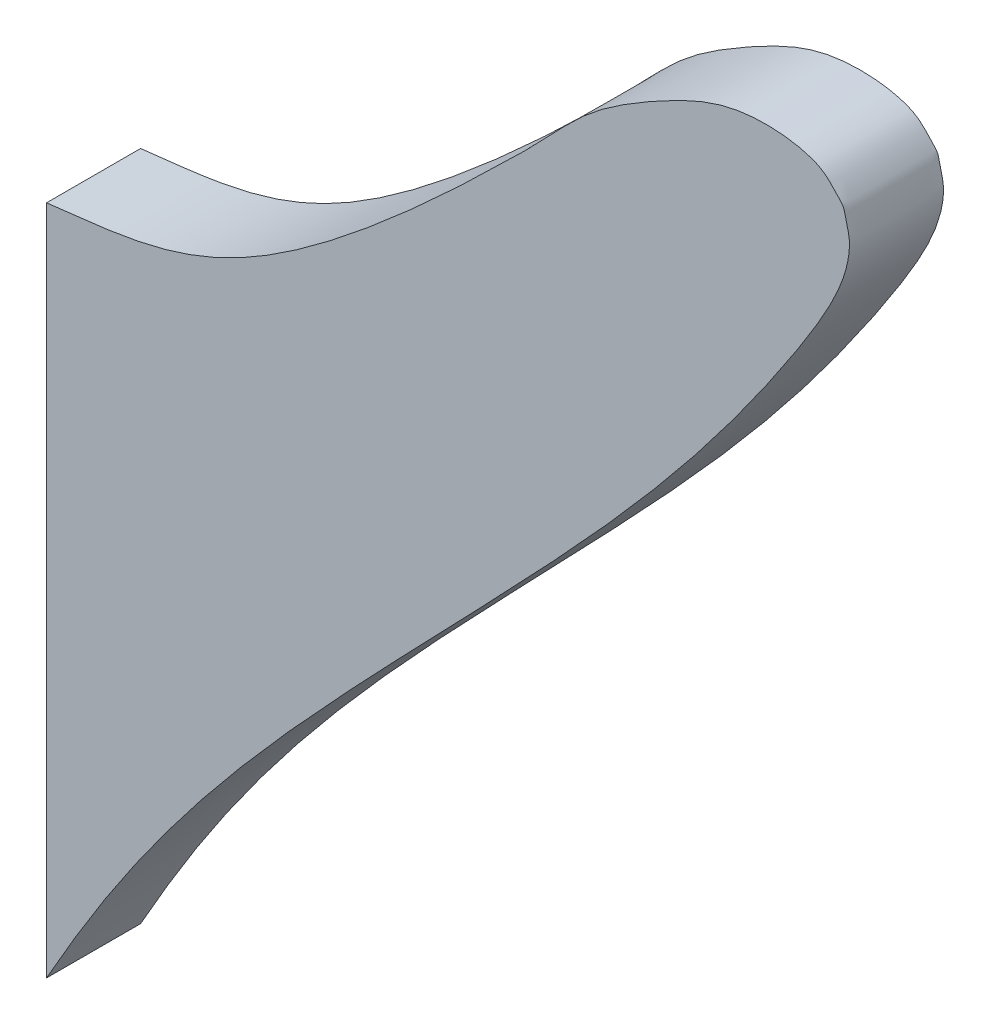
ISO-10303-21;
HEADER;
FILE_DESCRIPTION(('STEP AP214'),'2;1');
FILE_NAME('part.step','',(''),(''),'','','');
FILE_SCHEMA(('AUTOMOTIVE_DESIGN { 1 0 10303 214 1 1 1 1 }'));
ENDSEC;
DATA;
#1=APPLICATION_CONTEXT('core data for automotive mechanical design processes');
#2=APPLICATION_PROTOCOL_DEFINITION('international standard','automotive_design',2000,#1);
#3=PRODUCT_CONTEXT('',#1,'mechanical');
#4=PRODUCT('Part','Part','',(#3));
#5=PRODUCT_RELATED_PRODUCT_CATEGORY('part','',(#4));
#6=PRODUCT_DEFINITION_FORMATION('','',#4);
#7=PRODUCT_DEFINITION_CONTEXT('part definition',#1,'design');
#8=PRODUCT_DEFINITION('design','',#6,#7);
#9=PRODUCT_DEFINITION_SHAPE('','',#8);
#10=(LENGTH_UNIT() NAMED_UNIT(*) SI_UNIT(.MILLI.,.METRE.));
#11=(NAMED_UNIT(*) PLANE_ANGLE_UNIT() SI_UNIT($,.RADIAN.));
#12=(NAMED_UNIT(*) SI_UNIT($,.STERADIAN.) SOLID_ANGLE_UNIT());
#13=UNCERTAINTY_MEASURE_WITH_UNIT(LENGTH_MEASURE(1.E-05),#10,'distance_accuracy_value','');
#14=(GEOMETRIC_REPRESENTATION_CONTEXT(3) GLOBAL_UNCERTAINTY_ASSIGNED_CONTEXT((#13)) GLOBAL_UNIT_ASSIGNED_CONTEXT((#10,
#11,#12)) REPRESENTATION_CONTEXT('',''));
#15=CARTESIAN_POINT('',(0.,0.,0.));
#16=DIRECTION('',(0.,0.,1.));
#17=DIRECTION('',(1.,0.,0.));
#18=AXIS2_PLACEMENT_3D('',#15,#16,#17);
#19=CARTESIAN_POINT('',(32.099228330564,-93.1096221950851,83.9999999999997));
#20=CARTESIAN_POINT('',(32.5957820599692,-92.2330279151648,83.9999999999997));
#21=CARTESIAN_POINT('',(33.0951218752206,-91.3581978324059,83.9999999999997));
#22=CARTESIAN_POINT('',(34.1094025627134,-89.618416522737,83.9999999999997));
#23=CARTESIAN_POINT('',(34.6237793896912,-88.7531081327288,83.9999999999997));
#24=CARTESIAN_POINT('',(36.1931590651253,-86.1738044011613,83.9999999999997));
#25=CARTESIAN_POINT('',(37.274765064249,-84.4766546291517,83.9999999999997));
#26=CARTESIAN_POINT('',(39.5140338333732,-81.1305155319738,83.9999999999997));
#27=CARTESIAN_POINT('',(40.6722117242091,-79.4801608710243,83.9999999999997));
#28=CARTESIAN_POINT('',(43.0588989946347,-76.2316652140037,83.9999999999997));
#29=CARTESIAN_POINT('',(44.2853730079333,-74.6359957784043,83.9999999999997));
#30=CARTESIAN_POINT('',(48.0520736412831,-69.924274325562,83.9999999999997));
#31=CARTESIAN_POINT('',(50.6809620401847,-66.884702303374,83.9999999999997));
#32=CARTESIAN_POINT('',(56.0741438761168,-60.9223591711925,83.9999999999997));
#33=CARTESIAN_POINT('',(58.8344391330934,-57.9961047415613,83.9999999999997));
#34=CARTESIAN_POINT('',(64.3922696897535,-52.1758591561064,83.9999999999997));
#35=CARTESIAN_POINT('',(67.1902353910697,-49.2830992729907,83.9999999999997));
#36=CARTESIAN_POINT('',(72.7548859676472,-43.4690695804566,83.9999999999997));
#37=CARTESIAN_POINT('',(75.5214078421098,-40.5476512090801,83.9999999999997));
#38=CARTESIAN_POINT('',(79.5840894417048,-36.0861379883033,83.9999999999997));
#39=CARTESIAN_POINT('',(80.9235098056345,-34.5854716892154,83.9999999999997));
#40=CARTESIAN_POINT('',(83.5575634755656,-31.5433193339586,83.9999999999997));
#41=CARTESIAN_POINT('',(84.8524436716613,-30.0020582980105,83.9999999999997));
#42=CARTESIAN_POINT('',(87.3893325432273,-26.8713481394599,83.9999999999997));
#43=CARTESIAN_POINT('',(88.6317942863675,-25.2811290935483,83.9999999999997));
#44=CARTESIAN_POINT('',(91.049036471828,-22.0585161615974,83.9999999999997));
#45=CARTESIAN_POINT('',(92.2245345063367,-20.424691788881,83.9999999999997));
#46=CARTESIAN_POINT('',(94.5110208799733,-17.1131876936567,83.9999999999997));
#47=CARTESIAN_POINT('',(95.6273327327901,-15.439127032649,83.9999999999997));
#48=CARTESIAN_POINT('',(97.22943017208,-12.8788368230408,83.9999999999997));
#49=CARTESIAN_POINT('',(97.7497031607458,-12.0160526972969,83.9999999999997));
#50=CARTESIAN_POINT('',(98.7316070971936,-10.250618078432,83.9999999999997));
#51=CARTESIAN_POINT('',(99.1947968714466,-9.3468571377443,83.9999999999997));
#52=CARTESIAN_POINT('',(99.7602470161609,-7.94816674221357,83.9999999999997));
#53=CARTESIAN_POINT('',(99.9272322129646,-7.47391466398775,83.9999999999997));
#54=CARTESIAN_POINT('',(100.127320726445,-6.74373402352404,83.9999999999997));
#55=CARTESIAN_POINT('',(100.186284829965,-6.49745529208348,83.9999999999997));
#56=CARTESIAN_POINT('',(100.284526173099,-5.99755176866837,83.9999999999997));
#57=CARTESIAN_POINT('',(100.323432535258,-5.74485387858416,83.9999999999997));
#58=CARTESIAN_POINT('',(100.371203848613,-5.24083928050495,83.9999999999997));
#59=CARTESIAN_POINT('',(100.380289001774,-4.98849529040822,83.9999999999997));
#60=CARTESIAN_POINT('',(100.353666865192,-4.48278834387093,83.9999999999997));
#61=CARTESIAN_POINT('',(100.312750871623,-4.22770188919473,83.9999999999997));
#62=CARTESIAN_POINT('',(100.196295431205,-3.72668407850795,83.9999999999997));
#63=CARTESIAN_POINT('',(100.123405279225,-3.48000352448232,83.9999999999997));
#64=CARTESIAN_POINT('',(100.036667565735,-3.10408249723559,83.9999999999997));
#65=CARTESIAN_POINT('',(100.010429086327,-2.97807728455001,83.9999999999997));
#66=CARTESIAN_POINT('',(99.9543395516739,-2.72701010036028,83.9999999999997));
#67=CARTESIAN_POINT('',(99.923379377811,-2.602237719001,83.9999999999997));
#68=CARTESIAN_POINT('',(99.8090570241877,-2.36637508564809,83.9999999999997));
#69=CARTESIAN_POINT('',(99.7280428611345,-2.26068485694845,83.9999999999997));
#70=CARTESIAN_POINT('',(99.5565556897895,-2.06445239699321,83.9999999999997));
#71=CARTESIAN_POINT('',(99.4662161977567,-1.97026294518681,83.9999999999997));
#72=CARTESIAN_POINT('',(99.1958577870924,-1.68713062472285,83.9999999999997));
#73=CARTESIAN_POINT('',(99.0206282299158,-1.49331052659899,83.9999999999997));
#74=CARTESIAN_POINT('',(98.6538266214996,-1.12389483968848,83.9999999999997));
#75=CARTESIAN_POINT('',(98.4645808042253,-0.945888102777317,83.9999999999997));
#76=CARTESIAN_POINT('',(98.0458074493733,-0.636056236501907,83.9999999999997));
#77=CARTESIAN_POINT('',(97.8137170554325,-0.503115338925525,83.9999999999997));
#78=CARTESIAN_POINT('',(97.3365908709124,-0.284093792323029,83.9999999999997));
#79=CARTESIAN_POINT('',(97.0907112965205,-0.1952371296246,83.9999999999997));
#80=CARTESIAN_POINT('',(96.590239651119,-0.0421188029619063,83.9999999999997));
#81=CARTESIAN_POINT('',(96.3356387120472,0.0235563048458895,83.9999999999997));
#82=CARTESIAN_POINT('',(95.5647275756303,0.191011050820752,83.9999999999997));
#83=CARTESIAN_POINT('',(95.0464357421343,0.258967253696331,83.9999999999997));
#84=CARTESIAN_POINT('',(94.004838113524,0.344544678944924,83.9999999999997));
#85=CARTESIAN_POINT('',(93.4794052138563,0.360032990475676,83.9999999999997));
#86=CARTESIAN_POINT('',(92.4322113954403,0.337025366471198,83.9999999999997));
#87=CARTESIAN_POINT('',(91.9131962505047,0.29938296300682,83.9999999999997));
#88=CARTESIAN_POINT('',(90.8849239495179,0.168429625406537,83.9999999999997));
#89=CARTESIAN_POINT('',(90.3757412472808,0.0746939383324678,83.9999999999997));
#90=CARTESIAN_POINT('',(89.3680106019826,-0.173447869488458,83.9999999999997));
#91=CARTESIAN_POINT('',(88.8690537641019,-0.327226504412531,83.9999999999997));
#92=CARTESIAN_POINT('',(87.3865189943557,-0.859965719310441,83.9999999999997));
#93=CARTESIAN_POINT('',(86.444431793792,-1.29792225098329,83.9999999999997));
#94=CARTESIAN_POINT('',(85.0595029604763,-2.00532332360087,83.9999999999997));
#95=CARTESIAN_POINT('',(84.6025547288433,-2.24952467896947,83.9999999999997));
#96=CARTESIAN_POINT('',(83.694396512668,-2.74819574974252,83.9999999999997));
#97=CARTESIAN_POINT('',(83.2436814938118,-3.00355118613291,83.9999999999997));
#98=CARTESIAN_POINT('',(81.9025843266247,-3.78938724449986,83.9999999999997));
#99=CARTESIAN_POINT('',(81.0216111693178,-4.3367048736463,83.9999999999997));
#100=CARTESIAN_POINT('',(79.7376732511766,-5.22482508592158,83.9999999999997));
#101=CARTESIAN_POINT('',(79.3153287328466,-5.53322050005114,83.9999999999997));
#102=CARTESIAN_POINT('',(78.4917466961094,-6.17681509861942,83.9999999999997));
#103=CARTESIAN_POINT('',(78.0916836470616,-6.51118159606514,83.9999999999997));
#104=CARTESIAN_POINT('',(76.9286246109498,-7.5540744840487,83.9999999999997));
#105=CARTESIAN_POINT('',(76.2054019281063,-8.30522705552301,83.9999999999997));
#106=CARTESIAN_POINT('',(75.1268713464142,-9.4387114913547,83.9999999999997));
#107=CARTESIAN_POINT('',(74.768986199605,-9.81822273191319,83.9999999999997));
#108=CARTESIAN_POINT('',(74.0477578892523,-10.571698887942,83.9999999999997));
#109=CARTESIAN_POINT('',(73.6837563151489,-10.945017834883,83.9999999999997));
#110=CARTESIAN_POINT('',(72.5828545948093,-12.0559943862647,83.9999999999997));
#111=CARTESIAN_POINT('',(71.8373481779989,-12.7849651504354,83.9999999999997));
#112=CARTESIAN_POINT('',(70.3427028598642,-14.2392401878755,83.9999999999997));
#113=CARTESIAN_POINT('',(69.5941201583207,-14.9651058679252,83.9999999999997));
#114=CARTESIAN_POINT('',(67.3394558346251,-17.133703217655,83.9999999999997));
#115=CARTESIAN_POINT('',(65.8190333486185,-18.5609862447751,83.9999999999997));
#116=CARTESIAN_POINT('',(62.7315684414061,-21.3569497642824,83.9999999999997));
#117=CARTESIAN_POINT('',(61.1669554041556,-22.7295887407225,83.9999999999997));
#118=CARTESIAN_POINT('',(57.9737711081443,-25.3972405421279,83.9999999999997));
#119=CARTESIAN_POINT('',(56.3456008730415,-26.6927400898708,83.9999999999997));
#120=CARTESIAN_POINT('',(53.8240074390548,-28.5396967101901,83.9999999999997));
#121=CARTESIAN_POINT('',(52.9700388163531,-29.1390398376752,83.9999999999997));
#122=CARTESIAN_POINT('',(51.6612258415561,-30.0042407721745,83.9999999999997));
#123=CARTESIAN_POINT('',(51.2196946790628,-30.2872900845461,83.9999999999997));
#124=CARTESIAN_POINT('',(50.3336233937961,-30.8349338564283,83.9999999999997));
#125=CARTESIAN_POINT('',(49.8882620547073,-31.1000895623866,83.9999999999997));
#126=CARTESIAN_POINT('',(48.5441646147436,-31.865696479371,83.9999999999997));
#127=CARTESIAN_POINT('',(47.6372015603696,-32.3354918154368,83.9999999999997));
#128=CARTESIAN_POINT('',(45.797645643368,-33.1795788242573,83.9999999999997));
#129=CARTESIAN_POINT('',(44.8650686293624,-33.5539295533046,83.9999999999997));
#130=CARTESIAN_POINT('',(42.9732102257502,-34.203123216759,83.9999999999997));
#131=CARTESIAN_POINT('',(42.0138852186042,-34.4778036203062,83.9999999999997));
#132=CARTESIAN_POINT('',(40.071461275108,-34.9385762761407,83.9999999999997));
#133=CARTESIAN_POINT('',(39.0883526283966,-35.1246323449712,83.9999999999997));
#134=CARTESIAN_POINT('',(36.115097601689,-35.593634241483,83.9999999999997));
#135=CARTESIAN_POINT('',(34.1018193735866,-35.7903844873846,83.9999999999997));
#136=CARTESIAN_POINT('',(32.0992283305639,-36.0269581028376,83.9999999999997));
#137=B_SPLINE_CURVE_WITH_KNOTS('',3,(#19,#20,#21,#22,#23,#24,#25,#26,#27,#28,#29,#30,#31,#32,
#33,#34,#35,#36,#37,#38,#39,#40,#41,#42,#43,#44,#45,#46,#47,#48,#49,#50,#51,#52,#53,#54,#55,#56,
#57,#58,#59,#60,#61,#62,#63,#64,#65,#66,#67,#68,#69,#70,#71,#72,#73,#74,#75,#76,#77,#78,#79,#80,
#81,#82,#83,#84,#85,#86,#87,#88,#89,#90,#91,#92,#93,#94,#95,#96,#97,#98,#99,#100,#101,#102,#103,
#104,#105,#106,#107,#108,#109,#110,#111,#112,#113,#114,#115,#116,#117,#118,#119,#120,#121,#122,
#123,#124,#125,#126,#127,#128,#129,#130,#131,#132,#133,#134,#135,#136),.UNSPECIFIED.,.F.,.F.,(4,
2,2,2,2,2,2,2,2,2,2,2,2,2,2,2,2,2,2,2,2,2,2,2,2,2,2,2,2,2,2,2,2,2,2,2,2,2,2,2,2,2,2,2,2,2,2,2,2,
2,2,2,2,2,2,2,2,2,4),(0.,0.0156250000000003,0.0312500000000008,0.0625000000000012,
0.0937500000000018,0.125000000000002,0.187500000000003,0.250000000000005,0.312500000000006,
0.375000000000007,0.406250000000007,0.437500000000008,0.468750000000008,0.500000000000009,
0.531250000000009,0.54687500000001,0.56250000000001,0.57031250000001,0.57421875000001,
0.57812500000001,0.58203125000001,0.58593750000001,0.58984375000001,0.59179687500001,
0.59375000000001,0.59570312500001,0.59765625000001,0.601562500000011,0.605468750000011,
0.609375000000011,0.613281250000011,0.617187500000011,0.625000000000011,0.632812500000011,
0.640625000000011,0.648437500000011,0.656250000000011,0.671875000000011,0.679687500000011,
0.687500000000011,0.70312500000001,0.71093750000001,0.71875000000001,0.734375000000009,
0.742187500000009,0.750000000000009,0.765625000000008,0.781250000000008,0.812500000000007,
0.843750000000006,0.875000000000005,0.890625000000004,0.898437500000004,0.906250000000004,
0.921875000000003,0.937500000000003,0.953125000000002,0.968750000000001,1.),.UNSPECIFIED.);
#138=DIRECTION('',(0.,0.,-1.));
#139=VECTOR('',#138,1.);
#140=SURFACE_OF_LINEAR_EXTRUSION('',#137,#139);
#141=CARTESIAN_POINT('',(32.099228330564,-93.1096221950851,75.9999999999997));
#142=CARTESIAN_POINT('',(32.5957820599692,-92.2330279151648,75.9999999999997));
#143=CARTESIAN_POINT('',(33.0951218752206,-91.3581978324059,75.9999999999997));
#144=CARTESIAN_POINT('',(34.1094025627134,-89.618416522737,75.9999999999997));
#145=CARTESIAN_POINT('',(34.6237793896912,-88.7531081327288,75.9999999999997));
#146=CARTESIAN_POINT('',(36.1931590651253,-86.1738044011613,75.9999999999997));
#147=CARTESIAN_POINT('',(37.274765064249,-84.4766546291517,75.9999999999997));
#148=CARTESIAN_POINT('',(39.5140338333732,-81.1305155319738,75.9999999999997));
#149=CARTESIAN_POINT('',(40.6722117242091,-79.4801608710243,75.9999999999997));
#150=CARTESIAN_POINT('',(43.0588989946347,-76.2316652140037,75.9999999999997));
#151=CARTESIAN_POINT('',(44.2853730079333,-74.6359957784043,75.9999999999997));
#152=CARTESIAN_POINT('',(48.0520736412831,-69.924274325562,75.9999999999997));
#153=CARTESIAN_POINT('',(50.6809620401847,-66.884702303374,75.9999999999997));
#154=CARTESIAN_POINT('',(56.0741438761168,-60.9223591711925,75.9999999999997));
#155=CARTESIAN_POINT('',(58.8344391330934,-57.9961047415613,75.9999999999997));
#156=CARTESIAN_POINT('',(64.3922696897535,-52.1758591561064,75.9999999999997));
#157=CARTESIAN_POINT('',(67.1902353910697,-49.2830992729907,75.9999999999997));
#158=CARTESIAN_POINT('',(72.7548859676472,-43.4690695804566,75.9999999999997));
#159=CARTESIAN_POINT('',(75.5214078421098,-40.5476512090801,75.9999999999997));
#160=CARTESIAN_POINT('',(79.5840894417048,-36.0861379883033,75.9999999999997));
#161=CARTESIAN_POINT('',(80.9235098056345,-34.5854716892154,75.9999999999997));
#162=CARTESIAN_POINT('',(83.5575634755656,-31.5433193339586,75.9999999999997));
#163=CARTESIAN_POINT('',(84.8524436716613,-30.0020582980105,75.9999999999997));
#164=CARTESIAN_POINT('',(87.3893325432273,-26.8713481394599,75.9999999999997));
#165=CARTESIAN_POINT('',(88.6317942863675,-25.2811290935483,75.9999999999997));
#166=CARTESIAN_POINT('',(91.049036471828,-22.0585161615974,75.9999999999997));
#167=CARTESIAN_POINT('',(92.2245345063367,-20.424691788881,75.9999999999997));
#168=CARTESIAN_POINT('',(94.5110208799733,-17.1131876936567,75.9999999999997));
#169=CARTESIAN_POINT('',(95.6273327327901,-15.439127032649,75.9999999999997));
#170=CARTESIAN_POINT('',(97.22943017208,-12.8788368230408,75.9999999999997));
#171=CARTESIAN_POINT('',(97.7497031607458,-12.0160526972969,75.9999999999997));
#172=CARTESIAN_POINT('',(98.7316070971936,-10.250618078432,75.9999999999997));
#173=CARTESIAN_POINT('',(99.1947968714466,-9.3468571377443,75.9999999999997));
#174=CARTESIAN_POINT('',(99.7602470161609,-7.94816674221357,75.9999999999997));
#175=CARTESIAN_POINT('',(99.9272322129646,-7.47391466398775,75.9999999999997));
#176=CARTESIAN_POINT('',(100.127320726445,-6.74373402352404,75.9999999999997));
#177=CARTESIAN_POINT('',(100.186284829965,-6.49745529208348,75.9999999999997));
#178=CARTESIAN_POINT('',(100.284526173099,-5.99755176866837,75.9999999999997));
#179=CARTESIAN_POINT('',(100.323432535258,-5.74485387858416,75.9999999999997));
#180=CARTESIAN_POINT('',(100.371203848613,-5.24083928050495,75.9999999999997));
#181=CARTESIAN_POINT('',(100.380289001774,-4.98849529040822,75.9999999999997));
#182=CARTESIAN_POINT('',(100.353666865192,-4.48278834387093,75.9999999999997));
#183=CARTESIAN_POINT('',(100.312750871623,-4.22770188919473,75.9999999999997));
#184=CARTESIAN_POINT('',(100.196295431205,-3.72668407850795,75.9999999999997));
#185=CARTESIAN_POINT('',(100.123405279225,-3.48000352448232,75.9999999999997));
#186=CARTESIAN_POINT('',(100.036667565735,-3.10408249723559,75.9999999999997));
#187=CARTESIAN_POINT('',(100.010429086327,-2.97807728455001,75.9999999999997));
#188=CARTESIAN_POINT('',(99.9543395516739,-2.72701010036028,75.9999999999997));
#189=CARTESIAN_POINT('',(99.923379377811,-2.602237719001,75.9999999999997));
#190=CARTESIAN_POINT('',(99.8090570241877,-2.36637508564809,75.9999999999997));
#191=CARTESIAN_POINT('',(99.7280428611345,-2.26068485694845,75.9999999999997));
#192=CARTESIAN_POINT('',(99.5565556897895,-2.06445239699321,75.9999999999997));
#193=CARTESIAN_POINT('',(99.4662161977567,-1.97026294518681,75.9999999999997));
#194=CARTESIAN_POINT('',(99.1958577870924,-1.68713062472285,75.9999999999997));
#195=CARTESIAN_POINT('',(99.0206282299158,-1.49331052659899,75.9999999999997));
#196=CARTESIAN_POINT('',(98.6538266214996,-1.12389483968848,75.9999999999997));
#197=CARTESIAN_POINT('',(98.4645808042253,-0.945888102777317,75.9999999999997));
#198=CARTESIAN_POINT('',(98.0458074493733,-0.636056236501907,75.9999999999997));
#199=CARTESIAN_POINT('',(97.8137170554325,-0.503115338925525,75.9999999999997));
#200=CARTESIAN_POINT('',(97.3365908709124,-0.284093792323029,75.9999999999997));
#201=CARTESIAN_POINT('',(97.0907112965205,-0.1952371296246,75.9999999999997));
#202=CARTESIAN_POINT('',(96.590239651119,-0.0421188029619063,75.9999999999997));
#203=CARTESIAN_POINT('',(96.3356387120472,0.0235563048458895,75.9999999999997));
#204=CARTESIAN_POINT('',(95.5647275756303,0.191011050820752,75.9999999999997));
#205=CARTESIAN_POINT('',(95.0464357421343,0.258967253696331,75.9999999999997));
#206=CARTESIAN_POINT('',(94.004838113524,0.344544678944924,75.9999999999997));
#207=CARTESIAN_POINT('',(93.4794052138563,0.360032990475676,75.9999999999997));
#208=CARTESIAN_POINT('',(92.4322113954403,0.337025366471198,75.9999999999997));
#209=CARTESIAN_POINT('',(91.9131962505047,0.29938296300682,75.9999999999997));
#210=CARTESIAN_POINT('',(90.8849239495179,0.168429625406537,75.9999999999997));
#211=CARTESIAN_POINT('',(90.3757412472808,0.0746939383324678,75.9999999999997));
#212=CARTESIAN_POINT('',(89.3680106019826,-0.173447869488458,75.9999999999997));
#213=CARTESIAN_POINT('',(88.8690537641019,-0.327226504412531,75.9999999999997));
#214=CARTESIAN_POINT('',(87.3865189943557,-0.859965719310441,75.9999999999997));
#215=CARTESIAN_POINT('',(86.444431793792,-1.29792225098329,75.9999999999997));
#216=CARTESIAN_POINT('',(85.0595029604763,-2.00532332360087,75.9999999999997));
#217=CARTESIAN_POINT('',(84.6025547288433,-2.24952467896947,75.9999999999997));
#218=CARTESIAN_POINT('',(83.694396512668,-2.74819574974252,75.9999999999997));
#219=CARTESIAN_POINT('',(83.2436814938118,-3.00355118613291,75.9999999999997));
#220=CARTESIAN_POINT('',(81.9025843266247,-3.78938724449986,75.9999999999997));
#221=CARTESIAN_POINT('',(81.0216111693178,-4.3367048736463,75.9999999999997));
#222=CARTESIAN_POINT('',(79.7376732511766,-5.22482508592158,75.9999999999997));
#223=CARTESIAN_POINT('',(79.3153287328466,-5.53322050005114,75.9999999999997));
#224=CARTESIAN_POINT('',(78.4917466961094,-6.17681509861942,75.9999999999997));
#225=CARTESIAN_POINT('',(78.0916836470616,-6.51118159606514,75.9999999999997));
#226=CARTESIAN_POINT('',(76.9286246109498,-7.5540744840487,75.9999999999997));
#227=CARTESIAN_POINT('',(76.2054019281063,-8.30522705552301,75.9999999999997));
#228=CARTESIAN_POINT('',(75.1268713464142,-9.4387114913547,75.9999999999997));
#229=CARTESIAN_POINT('',(74.768986199605,-9.81822273191319,75.9999999999997));
#230=CARTESIAN_POINT('',(74.0477578892523,-10.571698887942,75.9999999999997));
#231=CARTESIAN_POINT('',(73.6837563151489,-10.945017834883,75.9999999999997));
#232=CARTESIAN_POINT('',(72.5828545948093,-12.0559943862647,75.9999999999997));
#233=CARTESIAN_POINT('',(71.8373481779989,-12.7849651504354,75.9999999999997));
#234=CARTESIAN_POINT('',(70.3427028598642,-14.2392401878755,75.9999999999997));
#235=CARTESIAN_POINT('',(69.5941201583207,-14.9651058679252,75.9999999999997));
#236=CARTESIAN_POINT('',(67.3394558346251,-17.133703217655,75.9999999999997));
#237=CARTESIAN_POINT('',(65.8190333486185,-18.5609862447751,75.9999999999997));
#238=CARTESIAN_POINT('',(62.7315684414061,-21.3569497642824,75.9999999999997));
#239=CARTESIAN_POINT('',(61.1669554041556,-22.7295887407225,75.9999999999997));
#240=CARTESIAN_POINT('',(57.9737711081443,-25.3972405421279,75.9999999999997));
#241=CARTESIAN_POINT('',(56.3456008730415,-26.6927400898708,75.9999999999997));
#242=CARTESIAN_POINT('',(53.8240074390548,-28.5396967101901,75.9999999999997));
#243=CARTESIAN_POINT('',(52.9700388163531,-29.1390398376752,75.9999999999997));
#244=CARTESIAN_POINT('',(51.6612258415561,-30.0042407721745,75.9999999999997));
#245=CARTESIAN_POINT('',(51.2196946790628,-30.2872900845461,75.9999999999997));
#246=CARTESIAN_POINT('',(50.3336233937961,-30.8349338564283,75.9999999999997));
#247=CARTESIAN_POINT('',(49.8882620547073,-31.1000895623866,75.9999999999997));
#248=CARTESIAN_POINT('',(48.5441646147436,-31.865696479371,75.9999999999997));
#249=CARTESIAN_POINT('',(47.6372015603696,-32.3354918154368,75.9999999999997));
#250=CARTESIAN_POINT('',(45.797645643368,-33.1795788242573,75.9999999999997));
#251=CARTESIAN_POINT('',(44.8650686293624,-33.5539295533046,75.9999999999997));
#252=CARTESIAN_POINT('',(42.9732102257502,-34.203123216759,75.9999999999997));
#253=CARTESIAN_POINT('',(42.0138852186042,-34.4778036203062,75.9999999999997));
#254=CARTESIAN_POINT('',(40.071461275108,-34.9385762761407,75.9999999999997));
#255=CARTESIAN_POINT('',(39.0883526283966,-35.1246323449712,75.9999999999997));
#256=CARTESIAN_POINT('',(36.115097601689,-35.593634241483,75.9999999999997));
#257=CARTESIAN_POINT('',(34.1018193735866,-35.7903844873846,75.9999999999997));
#258=CARTESIAN_POINT('',(32.0992283305639,-36.0269581028376,75.9999999999997));
#259=B_SPLINE_CURVE_WITH_KNOTS('',3,(#141,#142,#143,#144,#145,#146,#147,#148,#149,#150,#151,
#152,#153,#154,#155,#156,#157,#158,#159,#160,#161,#162,#163,#164,#165,#166,#167,#168,#169,#170,
#171,#172,#173,#174,#175,#176,#177,#178,#179,#180,#181,#182,#183,#184,#185,#186,#187,#188,#189,
#190,#191,#192,#193,#194,#195,#196,#197,#198,#199,#200,#201,#202,#203,#204,#205,#206,#207,#208,
#209,#210,#211,#212,#213,#214,#215,#216,#217,#218,#219,#220,#221,#222,#223,#224,#225,#226,#227,
#228,#229,#230,#231,#232,#233,#234,#235,#236,#237,#238,#239,#240,#241,#242,#243,#244,#245,#246,
#247,#248,#249,#250,#251,#252,#253,#254,#255,#256,#257,#258),.UNSPECIFIED.,.F.,.F.,(4,2,2,2,2,2,
2,2,2,2,2,2,2,2,2,2,2,2,2,2,2,2,2,2,2,2,2,2,2,2,2,2,2,2,2,2,2,2,2,2,2,2,2,2,2,2,2,2,2,2,2,2,2,2,
2,2,2,2,4),(0.,0.0156250000000003,0.0312500000000008,0.0625000000000012,0.0937500000000018,
0.125000000000002,0.187500000000003,0.250000000000005,0.312500000000006,0.375000000000007,
0.406250000000007,0.437500000000008,0.468750000000008,0.500000000000009,0.531250000000009,
0.54687500000001,0.56250000000001,0.57031250000001,0.57421875000001,0.57812500000001,
0.58203125000001,0.58593750000001,0.58984375000001,0.59179687500001,0.59375000000001,
0.59570312500001,0.59765625000001,0.601562500000011,0.605468750000011,0.609375000000011,
0.613281250000011,0.617187500000011,0.625000000000011,0.632812500000011,0.640625000000011,
0.648437500000011,0.656250000000011,0.671875000000011,0.679687500000011,0.687500000000011,
0.70312500000001,0.71093750000001,0.71875000000001,0.734375000000009,0.742187500000009,
0.750000000000009,0.765625000000008,0.781250000000008,0.812500000000007,0.843750000000006,
0.875000000000005,0.890625000000004,0.898437500000004,0.906250000000004,0.921875000000003,
0.937500000000003,0.953125000000002,0.968750000000001,1.),.UNSPECIFIED.);
#260=CARTESIAN_POINT('',(32.0992283305639,-93.1096221950853,75.9999999999997));
#261=VERTEX_POINT('',#260);
#262=CARTESIAN_POINT('',(32.099228330564,-36.0269581028375,75.9999999999997));
#263=VERTEX_POINT('',#262);
#264=EDGE_CURVE('E65',#261,#263,#259,.T.);
#265=ORIENTED_EDGE('',*,*,#264,.T.);
#266=DIRECTION('',(0.,0.,-1.));
#267=VECTOR('',#266,1.);
#268=CARTESIAN_POINT('',(32.099228330564,-36.0269581028375,83.9999999999997));
#269=LINE('',#268,#267);
#270=CARTESIAN_POINT('',(32.099228330564,-36.0269581028375,83.9999999999997));
#271=VERTEX_POINT('',#270);
#272=EDGE_CURVE('E11',#271,#263,#269,.T.);
#273=ORIENTED_EDGE('',*,*,#272,.F.);
#274=CARTESIAN_POINT('',(32.0992283305639,-36.0269581028376,83.9999999999997));
#275=CARTESIAN_POINT('',(34.1018193735866,-35.7903844873846,83.9999999999997));
#276=CARTESIAN_POINT('',(36.115097601689,-35.593634241483,83.9999999999997));
#277=CARTESIAN_POINT('',(39.0883526283966,-35.1246323449712,83.9999999999997));
#278=CARTESIAN_POINT('',(40.071461275108,-34.9385762761407,83.9999999999997));
#279=CARTESIAN_POINT('',(42.0138852186042,-34.4778036203062,83.9999999999997));
#280=CARTESIAN_POINT('',(42.9732102257502,-34.203123216759,83.9999999999997));
#281=CARTESIAN_POINT('',(44.8650686293624,-33.5539295533046,83.9999999999997));
#282=CARTESIAN_POINT('',(45.797645643368,-33.1795788242573,83.9999999999997));
#283=CARTESIAN_POINT('',(47.6372015603696,-32.3354918154368,83.9999999999997));
#284=CARTESIAN_POINT('',(48.5441646147436,-31.865696479371,83.9999999999997));
#285=CARTESIAN_POINT('',(49.8882620547073,-31.1000895623866,83.9999999999997));
#286=CARTESIAN_POINT('',(50.3336233937961,-30.8349338564283,83.9999999999997));
#287=CARTESIAN_POINT('',(51.2196946790628,-30.2872900845461,83.9999999999997));
#288=CARTESIAN_POINT('',(51.6612258415561,-30.0042407721745,83.9999999999997));
#289=CARTESIAN_POINT('',(52.9700388163531,-29.1390398376752,83.9999999999997));
#290=CARTESIAN_POINT('',(53.8240074390548,-28.5396967101901,83.9999999999997));
#291=CARTESIAN_POINT('',(56.3456008730415,-26.6927400898708,83.9999999999997));
#292=CARTESIAN_POINT('',(57.9737711081443,-25.3972405421279,83.9999999999997));
#293=CARTESIAN_POINT('',(61.1669554041556,-22.7295887407225,83.9999999999997));
#294=CARTESIAN_POINT('',(62.7315684414061,-21.3569497642824,83.9999999999997));
#295=CARTESIAN_POINT('',(65.8190333486185,-18.5609862447751,83.9999999999997));
#296=CARTESIAN_POINT('',(67.3394558346251,-17.133703217655,83.9999999999997));
#297=CARTESIAN_POINT('',(69.5941201583207,-14.9651058679252,83.9999999999997));
#298=CARTESIAN_POINT('',(70.3427028598642,-14.2392401878755,83.9999999999997));
#299=CARTESIAN_POINT('',(71.8373481779989,-12.7849651504354,83.9999999999997));
#300=CARTESIAN_POINT('',(72.5828545948093,-12.0559943862647,83.9999999999997));
#301=CARTESIAN_POINT('',(73.6837563151489,-10.945017834883,83.9999999999997));
#302=CARTESIAN_POINT('',(74.0477578892523,-10.571698887942,83.9999999999997));
#303=CARTESIAN_POINT('',(74.768986199605,-9.81822273191319,83.9999999999997));
#304=CARTESIAN_POINT('',(75.1268713464142,-9.4387114913547,83.9999999999997));
#305=CARTESIAN_POINT('',(76.2054019281063,-8.30522705552301,83.9999999999997));
#306=CARTESIAN_POINT('',(76.9286246109498,-7.5540744840487,83.9999999999997));
#307=CARTESIAN_POINT('',(78.0916836470616,-6.51118159606514,83.9999999999997));
#308=CARTESIAN_POINT('',(78.4917466961094,-6.17681509861942,83.9999999999997));
#309=CARTESIAN_POINT('',(79.3153287328466,-5.53322050005114,83.9999999999997));
#310=CARTESIAN_POINT('',(79.7376732511766,-5.22482508592158,83.9999999999997));
#311=CARTESIAN_POINT('',(81.0216111693178,-4.3367048736463,83.9999999999997));
#312=CARTESIAN_POINT('',(81.9025843266247,-3.78938724449986,83.9999999999997));
#313=CARTESIAN_POINT('',(83.2436814938118,-3.00355118613291,83.9999999999997));
#314=CARTESIAN_POINT('',(83.694396512668,-2.74819574974252,83.9999999999997));
#315=CARTESIAN_POINT('',(84.6025547288433,-2.24952467896947,83.9999999999997));
#316=CARTESIAN_POINT('',(85.0595029604763,-2.00532332360087,83.9999999999997));
#317=CARTESIAN_POINT('',(86.444431793792,-1.29792225098329,83.9999999999997));
#318=CARTESIAN_POINT('',(87.3865189943557,-0.859965719310441,83.9999999999997));
#319=CARTESIAN_POINT('',(88.8690537641019,-0.327226504412531,83.9999999999997));
#320=CARTESIAN_POINT('',(89.3680106019826,-0.173447869488458,83.9999999999997));
#321=CARTESIAN_POINT('',(90.3757412472808,0.0746939383324678,83.9999999999997));
#322=CARTESIAN_POINT('',(90.8849239495179,0.168429625406537,83.9999999999997));
#323=CARTESIAN_POINT('',(91.9131962505047,0.29938296300682,83.9999999999997));
#324=CARTESIAN_POINT('',(92.4322113954403,0.337025366471198,83.9999999999997));
#325=CARTESIAN_POINT('',(93.4794052138563,0.360032990475676,83.9999999999997));
#326=CARTESIAN_POINT('',(94.004838113524,0.344544678944924,83.9999999999997));
#327=CARTESIAN_POINT('',(95.0464357421343,0.258967253696331,83.9999999999997));
#328=CARTESIAN_POINT('',(95.5647275756303,0.191011050820752,83.9999999999997));
#329=CARTESIAN_POINT('',(96.3356387120472,0.0235563048458895,83.9999999999997));
#330=CARTESIAN_POINT('',(96.590239651119,-0.0421188029619063,83.9999999999997));
#331=CARTESIAN_POINT('',(97.0907112965205,-0.1952371296246,83.9999999999997));
#332=CARTESIAN_POINT('',(97.3365908709124,-0.284093792323029,83.9999999999997));
#333=CARTESIAN_POINT('',(97.8137170554325,-0.503115338925525,83.9999999999997));
#334=CARTESIAN_POINT('',(98.0458074493733,-0.636056236501907,83.9999999999997));
#335=CARTESIAN_POINT('',(98.4645808042253,-0.945888102777317,83.9999999999997));
#336=CARTESIAN_POINT('',(98.6538266214996,-1.12389483968848,83.9999999999997));
#337=CARTESIAN_POINT('',(99.0206282299158,-1.49331052659899,83.9999999999997));
#338=CARTESIAN_POINT('',(99.1958577870924,-1.68713062472285,83.9999999999997));
#339=CARTESIAN_POINT('',(99.4662161977567,-1.97026294518681,83.9999999999997));
#340=CARTESIAN_POINT('',(99.5565556897895,-2.06445239699321,83.9999999999997));
#341=CARTESIAN_POINT('',(99.7280428611345,-2.26068485694845,83.9999999999997));
#342=CARTESIAN_POINT('',(99.8090570241877,-2.36637508564809,83.9999999999997));
#343=CARTESIAN_POINT('',(99.923379377811,-2.602237719001,83.9999999999997));
#344=CARTESIAN_POINT('',(99.9543395516739,-2.72701010036028,83.9999999999997));
#345=CARTESIAN_POINT('',(100.010429086327,-2.97807728455001,83.9999999999997));
#346=CARTESIAN_POINT('',(100.036667565735,-3.10408249723559,83.9999999999997));
#347=CARTESIAN_POINT('',(100.123405279225,-3.48000352448232,83.9999999999997));
#348=CARTESIAN_POINT('',(100.196295431205,-3.72668407850795,83.9999999999997));
#349=CARTESIAN_POINT('',(100.312750871623,-4.22770188919473,83.9999999999997));
#350=CARTESIAN_POINT('',(100.353666865192,-4.48278834387093,83.9999999999997));
#351=CARTESIAN_POINT('',(100.380289001774,-4.98849529040822,83.9999999999997));
#352=CARTESIAN_POINT('',(100.371203848613,-5.24083928050495,83.9999999999997));
#353=CARTESIAN_POINT('',(100.323432535258,-5.74485387858416,83.9999999999997));
#354=CARTESIAN_POINT('',(100.284526173099,-5.99755176866837,83.9999999999997));
#355=CARTESIAN_POINT('',(100.186284829965,-6.49745529208348,83.9999999999997));
#356=CARTESIAN_POINT('',(100.127320726445,-6.74373402352404,83.9999999999997));
#357=CARTESIAN_POINT('',(99.9272322129646,-7.47391466398775,83.9999999999997));
#358=CARTESIAN_POINT('',(99.7602470161609,-7.94816674221357,83.9999999999997));
#359=CARTESIAN_POINT('',(99.1947968714466,-9.3468571377443,83.9999999999997));
#360=CARTESIAN_POINT('',(98.7316070971936,-10.250618078432,83.9999999999997));
#361=CARTESIAN_POINT('',(97.7497031607458,-12.0160526972969,83.9999999999997));
#362=CARTESIAN_POINT('',(97.22943017208,-12.8788368230408,83.9999999999997));
#363=CARTESIAN_POINT('',(95.6273327327901,-15.439127032649,83.9999999999997));
#364=CARTESIAN_POINT('',(94.5110208799733,-17.1131876936567,83.9999999999997));
#365=CARTESIAN_POINT('',(92.2245345063367,-20.424691788881,83.9999999999997));
#366=CARTESIAN_POINT('',(91.049036471828,-22.0585161615974,83.9999999999997));
#367=CARTESIAN_POINT('',(88.6317942863675,-25.2811290935483,83.9999999999997));
#368=CARTESIAN_POINT('',(87.3893325432273,-26.8713481394599,83.9999999999997));
#369=CARTESIAN_POINT('',(84.8524436716613,-30.0020582980105,83.9999999999997));
#370=CARTESIAN_POINT('',(83.5575634755656,-31.5433193339586,83.9999999999997));
#371=CARTESIAN_POINT('',(80.9235098056345,-34.5854716892154,83.9999999999997));
#372=CARTESIAN_POINT('',(79.5840894417048,-36.0861379883033,83.9999999999997));
#373=CARTESIAN_POINT('',(75.5214078421098,-40.5476512090801,83.9999999999997));
#374=CARTESIAN_POINT('',(72.7548859676472,-43.4690695804566,83.9999999999997));
#375=CARTESIAN_POINT('',(67.1902353910697,-49.2830992729907,83.9999999999997));
#376=CARTESIAN_POINT('',(64.3922696897535,-52.1758591561064,83.9999999999997));
#377=CARTESIAN_POINT('',(58.8344391330934,-57.9961047415613,83.9999999999997));
#378=CARTESIAN_POINT('',(56.0741438761168,-60.9223591711925,83.9999999999997));
#379=CARTESIAN_POINT('',(50.6809620401847,-66.884702303374,83.9999999999997));
#380=CARTESIAN_POINT('',(48.0520736412831,-69.924274325562,83.9999999999997));
#381=CARTESIAN_POINT('',(44.2853730079333,-74.6359957784043,83.9999999999997));
#382=CARTESIAN_POINT('',(43.0588989946347,-76.2316652140037,83.9999999999997));
#383=CARTESIAN_POINT('',(40.6722117242091,-79.4801608710243,83.9999999999997));
#384=CARTESIAN_POINT('',(39.5140338333732,-81.1305155319738,83.9999999999997));
#385=CARTESIAN_POINT('',(37.274765064249,-84.4766546291517,83.9999999999997));
#386=CARTESIAN_POINT('',(36.1931590651253,-86.1738044011613,83.9999999999997));
#387=CARTESIAN_POINT('',(34.6237793896912,-88.7531081327288,83.9999999999997));
#388=CARTESIAN_POINT('',(34.1094025627134,-89.618416522737,83.9999999999997));
#389=CARTESIAN_POINT('',(33.0951218752206,-91.3581978324059,83.9999999999997));
#390=CARTESIAN_POINT('',(32.5957820599692,-92.2330279151648,83.9999999999997));
#391=CARTESIAN_POINT('',(32.099228330564,-93.1096221950851,83.9999999999997));
#392=B_SPLINE_CURVE_WITH_KNOTS('',3,(#274,#275,#276,#277,#278,#279,#280,#281,#282,#283,#284,
#285,#286,#287,#288,#289,#290,#291,#292,#293,#294,#295,#296,#297,#298,#299,#300,#301,#302,#303,
#304,#305,#306,#307,#308,#309,#310,#311,#312,#313,#314,#315,#316,#317,#318,#319,#320,#321,#322,
#323,#324,#325,#326,#327,#328,#329,#330,#331,#332,#333,#334,#335,#336,#337,#338,#339,#340,#341,
#342,#343,#344,#345,#346,#347,#348,#349,#350,#351,#352,#353,#354,#355,#356,#357,#358,#359,#360,
#361,#362,#363,#364,#365,#366,#367,#368,#369,#370,#371,#372,#373,#374,#375,#376,#377,#378,#379,
#380,#381,#382,#383,#384,#385,#386,#387,#388,#389,#390,#391),.UNSPECIFIED.,.F.,.F.,(4,2,2,2,2,2,
2,2,2,2,2,2,2,2,2,2,2,2,2,2,2,2,2,2,2,2,2,2,2,2,2,2,2,2,2,2,2,2,2,2,2,2,2,2,2,2,2,2,2,2,2,2,2,2,
2,2,2,2,4),(0.,0.0312499999999988,0.0468749999999981,0.0624999999999974,0.0781249999999969,
0.0937499999999962,0.101562499999996,0.109374999999996,0.124999999999995,0.156249999999994,
0.187499999999993,0.218749999999992,0.234374999999992,0.249999999999991,0.257812499999991,
0.265624999999991,0.28124999999999,0.28906249999999,0.29687499999999,0.312499999999989,
0.320312499999989,0.328124999999989,0.343749999999989,0.351562499999989,0.359374999999989,
0.367187499999989,0.374999999999989,0.382812499999989,0.386718749999989,0.390624999999989,
0.394531249999989,0.398437499999989,0.40234374999999,0.40429687499999,0.40624999999999,
0.40820312499999,0.41015624999999,0.41406249999999,0.41796874999999,0.42187499999999,
0.42578124999999,0.42968749999999,0.43749999999999,0.45312499999999,0.468749999999991,
0.499999999999991,0.531249999999992,0.562499999999992,0.593749999999993,0.624999999999993,
0.687499999999994,0.749999999999995,0.812499999999997,0.874999999999998,0.906249999999998,
0.937499999999999,0.968749999999999,0.984375,1.),.UNSPECIFIED.);
#393=CARTESIAN_POINT('',(32.0992283305639,-93.1096221950853,83.9999999999997));
#394=VERTEX_POINT('',#393);
#395=EDGE_CURVE('E64',#394,#271,#392,.F.);
#396=ORIENTED_EDGE('',*,*,#395,.F.);
#397=DIRECTION('',(0.,0.,-1.));
#398=VECTOR('',#397,1.);
#399=CARTESIAN_POINT('',(32.0992283305639,-93.1096221950853,83.9999999999997));
#400=LINE('',#399,#398);
#401=EDGE_CURVE('E41',#394,#261,#400,.T.);
#402=ORIENTED_EDGE('',*,*,#401,.T.);
#403=EDGE_LOOP('',(#265,#273,#396,#402));
#404=FACE_BOUND('',#403,.T.);
#405=ADVANCED_FACE('F30',(#404),#140,.F.);
#406=CARTESIAN_POINT('',(32.0992283305639,-93.1096221950853,83.9999999999997));
#407=DIRECTION('',(1.,0.,0.));
#408=DIRECTION('',(0.,1.,0.));
#409=AXIS2_PLACEMENT_3D('',#406,#407,#408);
#410=PLANE('',#409);
#411=DIRECTION('',(0.,-1.,0.));
#412=VECTOR('',#411,1.);
#413=CARTESIAN_POINT('',(32.0992283305639,-93.1096221950853,75.9999999999997));
#414=LINE('',#413,#412);
#415=EDGE_CURVE('E57',#263,#261,#414,.T.);
#416=ORIENTED_EDGE('',*,*,#415,.T.);
#417=ORIENTED_EDGE('',*,*,#401,.F.);
#418=DIRECTION('',(0.,-1.,0.));
#419=VECTOR('',#418,1.);
#420=CARTESIAN_POINT('',(32.0992283305639,-93.1096221950853,83.9999999999997));
#421=LINE('',#420,#419);
#422=EDGE_CURVE('E49',#271,#394,#421,.T.);
#423=ORIENTED_EDGE('',*,*,#422,.F.);
#424=ORIENTED_EDGE('',*,*,#272,.T.);
#425=EDGE_LOOP('',(#416,#417,#423,#424));
#426=FACE_BOUND('',#425,.T.);
#427=ADVANCED_FACE('F60',(#426),#410,.F.);
#428=CARTESIAN_POINT('',(93.3677776931541,-18.7689397412702,83.9999999999997));
#429=DIRECTION('',(0.,0.,1.));
#430=DIRECTION('',(1.,0.,0.));
#431=AXIS2_PLACEMENT_3D('',#428,#429,#430);
#432=PLANE('',#431);
#433=ORIENTED_EDGE('',*,*,#395,.T.);
#434=ORIENTED_EDGE('',*,*,#422,.T.);
#435=EDGE_LOOP('',(#433,#434));
#436=FACE_BOUND('',#435,.T.);
#437=ADVANCED_FACE('F87',(#436),#432,.T.);
#438=CARTESIAN_POINT('',(93.3677776931541,-18.7689397412702,75.9999999999997));
#439=DIRECTION('',(0.,0.,1.));
#440=DIRECTION('',(1.,0.,0.));
#441=AXIS2_PLACEMENT_3D('',#438,#439,#440);
#442=PLANE('',#441);
#443=ORIENTED_EDGE('',*,*,#264,.F.);
#444=ORIENTED_EDGE('',*,*,#415,.F.);
#445=EDGE_LOOP('',(#443,#444));
#446=FACE_BOUND('',#445,.T.);
#447=ADVANCED_FACE('F71',(#446),#442,.F.);
#448=CLOSED_SHELL('',(#405,#427,#437,#447));
#449=MANIFOLD_SOLID_BREP('B2',#448);
#450=ADVANCED_BREP_SHAPE_REPRESENTATION('',(#18,#449),#14);
#451=SHAPE_DEFINITION_REPRESENTATION(#9,#450);
ENDSEC;
END-ISO-10303-21;
